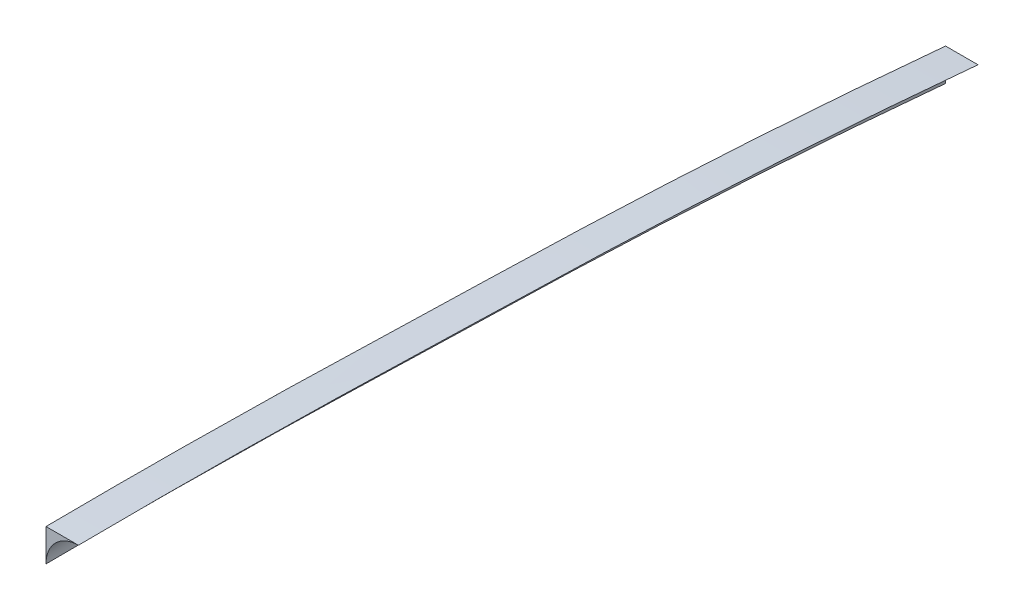
ISO-10303-21;
HEADER;
FILE_DESCRIPTION(('STEP AP214'),'2;1');
FILE_NAME('part.step','',(''),(''),'','','');
FILE_SCHEMA(('AUTOMOTIVE_DESIGN { 1 0 10303 214 1 1 1 1 }'));
ENDSEC;
DATA;
#1=APPLICATION_CONTEXT('core data for automotive mechanical design processes');
#2=APPLICATION_PROTOCOL_DEFINITION('international standard','automotive_design',2000,#1);
#3=PRODUCT_CONTEXT('',#1,'mechanical');
#4=PRODUCT('Part','Part','',(#3));
#5=PRODUCT_RELATED_PRODUCT_CATEGORY('part','',(#4));
#6=PRODUCT_DEFINITION_FORMATION('','',#4);
#7=PRODUCT_DEFINITION_CONTEXT('part definition',#1,'design');
#8=PRODUCT_DEFINITION('design','',#6,#7);
#9=PRODUCT_DEFINITION_SHAPE('','',#8);
#10=(LENGTH_UNIT() NAMED_UNIT(*) SI_UNIT(.MILLI.,.METRE.));
#11=(NAMED_UNIT(*) PLANE_ANGLE_UNIT() SI_UNIT($,.RADIAN.));
#12=(NAMED_UNIT(*) SI_UNIT($,.STERADIAN.) SOLID_ANGLE_UNIT());
#13=UNCERTAINTY_MEASURE_WITH_UNIT(LENGTH_MEASURE(1.E-05),#10,'distance_accuracy_value','');
#14=(GEOMETRIC_REPRESENTATION_CONTEXT(3) GLOBAL_UNCERTAINTY_ASSIGNED_CONTEXT((#13)) GLOBAL_UNIT_ASSIGNED_CONTEXT((#10,
#11,#12)) REPRESENTATION_CONTEXT('',''));
#15=CARTESIAN_POINT('',(0.,0.,0.));
#16=DIRECTION('',(0.,0.,1.));
#17=DIRECTION('',(1.,0.,0.));
#18=AXIS2_PLACEMENT_3D('',#15,#16,#17);
#19=CARTESIAN_POINT('',(545.921789204401,117.985789350312,0.));
#20=DIRECTION('',(0.,0.,-1.));
#21=DIRECTION('',(-1.,0.,0.));
#22=AXIS2_PLACEMENT_3D('',#19,#20,#21);
#23=PLANE('',#22);
#24=DIRECTION('',(0.,-1.,0.));
#25=VECTOR('',#24,1.);
#26=CARTESIAN_POINT('',(469.721789204401,194.185789350312,0.));
#27=LINE('',#26,#25);
#28=CARTESIAN_POINT('',(469.721789204401,194.185789350312,0.));
#29=VERTEX_POINT('',#28);
#30=CARTESIAN_POINT('',(469.721796592813,117.979425274758,-0.00025143511217518));
#31=VERTEX_POINT('',#30);
#32=EDGE_CURVE('E191',#29,#31,#27,.T.);
#33=ORIENTED_EDGE('',*,*,#32,.T.);
#34=CARTESIAN_POINT('',(545.921789204401,117.985789350312,0.));
#35=DIRECTION('',(0.,0.,-1.));
#36=DIRECTION('',(-1.,0.,0.));
#37=AXIS2_PLACEMENT_3D('',#34,#35,#36);
#38=CIRCLE('',#37,76.2);
#39=CARTESIAN_POINT('',(545.921792078561,194.183313666382,-9.78105702587246E-05));
#40=VERTEX_POINT('',#39);
#41=EDGE_CURVE('E78',#31,#40,#38,.T.);
#42=ORIENTED_EDGE('',*,*,#41,.T.);
#43=DIRECTION('',(1.,0.,0.));
#44=VECTOR('',#43,1.);
#45=CARTESIAN_POINT('',(469.721789204401,194.185789350312,0.));
#46=LINE('',#45,#44);
#47=EDGE_CURVE('E13',#29,#40,#46,.T.);
#48=ORIENTED_EDGE('',*,*,#47,.F.);
#49=EDGE_LOOP('',(#33,#42,#48));
#50=FACE_BOUND('',#49,.T.);
#51=ADVANCED_FACE('F68',(#50),#23,.F.);
#52=CARTESIAN_POINT('',(606.246520423227,99.1964787103507,-2052.91158045471));
#53=DIRECTION('',(0.,0.,-1.));
#54=DIRECTION('',(-1.,0.,0.));
#55=AXIS2_PLACEMENT_3D('',#52,#53,#54);
#56=PLANE('',#55);
#57=DIRECTION('',(0.,1.,0.));
#58=VECTOR('',#57,1.);
#59=CARTESIAN_POINT('',(530.046520423227,99.1964787103507,-2052.91158045471));
#60=LINE('',#59,#58);
#61=CARTESIAN_POINT('',(530.046544013096,99.2085460870408,-2052.91238324179));
#62=VERTEX_POINT('',#61);
#63=CARTESIAN_POINT('',(530.046520284828,175.396407935246,-2052.91157574486));
#64=VERTEX_POINT('',#63);
#65=EDGE_CURVE('E110',#62,#64,#60,.T.);
#66=ORIENTED_EDGE('',*,*,#65,.T.);
#67=DIRECTION('',(1.,0.,0.));
#68=VECTOR('',#67,1.);
#69=CARTESIAN_POINT('',(530.046520423227,175.396478710351,-2052.91158045471));
#70=LINE('',#69,#68);
#71=CARTESIAN_POINT('',(606.246529514757,175.401129488513,-2052.91188984868));
#72=VERTEX_POINT('',#71);
#73=EDGE_CURVE('E112',#64,#72,#70,.T.);
#74=ORIENTED_EDGE('',*,*,#73,.T.);
#75=CARTESIAN_POINT('',(606.246520423227,99.1964787103507,-2052.91158045471));
#76=DIRECTION('',(0.,0.,-1.));
#77=DIRECTION('',(-1.,0.,0.));
#78=AXIS2_PLACEMENT_3D('',#75,#76,#77);
#79=CIRCLE('',#78,76.1999999999999);
#80=EDGE_CURVE('E106',#62,#72,#79,.T.);
#81=ORIENTED_EDGE('',*,*,#80,.F.);
#82=EDGE_LOOP('',(#66,#74,#81));
#83=FACE_BOUND('',#82,.T.);
#84=ADVANCED_FACE('F109',(#83),#56,.T.);
#85=CARTESIAN_POINT('',(606.246529514757,175.401129488513,-2052.91188984868));
#86=CARTESIAN_POINT('',(596.872245214797,196.64354472673,-1733.89551946396));
#87=CARTESIAN_POINT('',(587.473353429833,207.338535542105,-1414.04173149098));
#88=CARTESIAN_POINT('',(577.994890395575,207.456825463627,-1091.48005347282));
#89=CARTESIAN_POINT('',(573.92861004286,207.46977992916,-953.100422817129));
#90=CARTESIAN_POINT('',(569.862342610043,207.457360570401,-814.721231838617));
#91=CARTESIAN_POINT('',(565.192095642697,207.457360570505,-655.788006789196));
#92=CARTESIAN_POINT('',(563.826546319493,207.392263536466,-609.316983004313));
#93=CARTESIAN_POINT('',(561.795941851718,206.99889263727,-540.213460402665));
#94=CARTESIAN_POINT('',(559.739448657553,206.30930387688,-470.228918273267));
#95=CARTESIAN_POINT('',(557.682228489811,205.339471183982,-400.219636498245));
#96=CARTESIAN_POINT('',(554.978276083907,203.683375419938,-308.201402932575));
#97=CARTESIAN_POINT('',(552.216748444005,201.41374639747,-214.223825956145));
#98=CARTESIAN_POINT('',(549.008005719743,198.105087894449,-105.027067607676));
#99=CARTESIAN_POINT('',(547.114847768712,195.790455712003,-40.6009889037087));
#100=CARTESIAN_POINT('',(545.921792078561,194.183313666382,-9.78105702587246E-05));
#101=CARTESIAN_POINT('',(599.896528745596,175.40073602574,-2052.91186367336));
#102=CARTESIAN_POINT('',(590.525034891807,196.636980314298,-1733.99045499246));
#103=CARTESIAN_POINT('',(581.128868103074,207.332231678563,-1414.22940139569));
#104=CARTESIAN_POINT('',(571.653061514198,207.456797075328,-1091.75812489902));
#105=CARTESIAN_POINT('',(567.58792177255,207.470438796602,-953.417310390911));
#106=CARTESIAN_POINT('',(563.522795636223,207.457360570401,-815.076958885585));
#107=CARTESIAN_POINT('',(558.853859099506,207.457360570507,-656.188329115092));
#108=CARTESIAN_POINT('',(557.487536770617,207.393504276549,-609.690999165365));
#109=CARTESIAN_POINT('',(555.454292251116,207.000931980056,-540.497632934888));
#110=CARTESIAN_POINT('',(553.397317357057,206.312684302951,-470.49669807118));
#111=CARTESIAN_POINT('',(551.339681419449,205.343406986554,-400.473267227328));
#112=CARTESIAN_POINT('',(548.631936988678,203.686118657451,-308.325987222446));
#113=CARTESIAN_POINT('',(545.871443521592,201.418157999229,-214.383604192278));
#114=CARTESIAN_POINT('',(542.658209961143,198.105411511501,-105.034018148974));
#115=CARTESIAN_POINT('',(540.765487128955,195.791351607397,-40.6227469790423));
#116=CARTESIAN_POINT('',(539.571791839073,194.183519951964,-8.96605351833139E-05));
#117=CARTESIAN_POINT('',(587.196527207275,175.399949100196,-2052.91181132272));
#118=CARTESIAN_POINT('',(577.830614245828,196.623851489432,-1734.18032604947));
#119=CARTESIAN_POINT('',(568.439897449557,207.319623951478,-1414.60474120509));
#120=CARTESIAN_POINT('',(558.969403751443,207.456740298728,-1092.31426775141));
#121=CARTESIAN_POINT('',(554.906545231931,207.471756531486,-954.051085538475));
#122=CARTESIAN_POINT('',(550.843701688584,207.457360570401,-815.788412979518));
#123=CARTESIAN_POINT('',(546.177386013126,207.457360570509,-656.988973766884));
#124=CARTESIAN_POINT('',(544.809517672866,207.395985756716,-610.439031487466));
#125=CARTESIAN_POINT('',(542.770993049913,207.005010665628,-541.065977999333));
#126=CARTESIAN_POINT('',(540.713054756065,206.319445155094,-471.032257667006));
#127=CARTESIAN_POINT('',(538.654587278724,205.351278591697,-400.980528685496));
#128=CARTESIAN_POINT('',(535.939258798222,203.691605132478,-308.575155802187));
#129=CARTESIAN_POINT('',(533.180833676766,201.426981202749,-214.703160664544));
#130=CARTESIAN_POINT('',(529.958618443944,198.106058745606,-105.047919231571));
#131=CARTESIAN_POINT('',(528.066765849441,195.793143398186,-40.6662631297094));
#132=CARTESIAN_POINT('',(526.871791360096,194.183932523129,-7.33604650324926E-05));
#133=CARTESIAN_POINT('',(568.146524899792,175.398768711879,-2052.91173279677));
#134=CARTESIAN_POINT('',(558.788983276858,196.604158252134,-1734.46513263498));
#135=CARTESIAN_POINT('',(549.406441469279,207.300712360851,-1415.1677509192));
#136=CARTESIAN_POINT('',(539.943917107309,207.456655133829,-1093.14848203));
#137=CARTESIAN_POINT('',(535.884480421001,207.473733133812,-955.001748259824));
#138=CARTESIAN_POINT('',(531.825060767123,207.457360570401,-816.855594120421));
#139=CARTESIAN_POINT('',(527.162676383553,207.457360570512,-658.189940744574));
#140=CARTESIAN_POINT('',(525.792489026237,207.399707976966,-611.561079970621));
#141=CARTESIAN_POINT('',(523.746044248107,207.011128693986,-541.918495596003));
#142=CARTESIAN_POINT('',(521.686660854576,206.329586433308,-471.835597060747));
#143=CARTESIAN_POINT('',(519.626946067635,205.363085999411,-401.741420872748));
#144=CARTESIAN_POINT('',(516.900241512535,203.699834845019,-308.948908671801));
#145=CARTESIAN_POINT('',(514.144918909526,201.440216008028,-215.182495372944));
#146=CARTESIAN_POINT('',(510.909231168143,198.107029596764,-105.068770855466));
#147=CARTESIAN_POINT('',(509.018683930168,195.79583108437,-40.7315373557102));
#148=CARTESIAN_POINT('',(507.82179064163,194.184551379877,-4.89103598062606E-05));
#149=CARTESIAN_POINT('',(549.096522592311,175.397588323562,-2052.91165427082));
#150=CARTESIAN_POINT('',(539.74735230789,196.584465014836,-1734.74993922049));
#151=CARTESIAN_POINT('',(530.372985489003,207.281800770224,-1415.73076063331));
#152=CARTESIAN_POINT('',(520.918430463177,207.45656996893,-1093.98269630859));
#153=CARTESIAN_POINT('',(516.862415610073,207.475709736137,-955.952410981169));
#154=CARTESIAN_POINT('',(512.806419845664,207.457360570401,-817.92277526132));
#155=CARTESIAN_POINT('',(508.147966753983,207.457360570516,-659.39090772226));
#156=CARTESIAN_POINT('',(506.77546037961,207.403430197216,-612.683128453773));
#157=CARTESIAN_POINT('',(504.721095446303,207.017246722343,-542.771013192671));
#158=CARTESIAN_POINT('',(502.660266953089,206.339727711521,-472.638936454486));
#159=CARTESIAN_POINT('',(500.599304856548,205.374893407125,-402.502313059999));
#160=CARTESIAN_POINT('',(497.861224226851,203.708064557559,-309.322661541412));
#161=CARTESIAN_POINT('',(495.109004142288,201.453450813307,-215.661830081343));
#162=CARTESIAN_POINT('',(491.859843892345,198.108000447921,-105.08962247936));
#163=CARTESIAN_POINT('',(489.970602010897,195.798518770553,-40.7968115817109));
#164=CARTESIAN_POINT('',(488.771789923165,194.185170236624,-2.44602545800286E-05));
#165=CARTESIAN_POINT('',(536.396521053989,175.396801398018,-2052.91160192018));
#166=CARTESIAN_POINT('',(527.05293166191,196.57133618997,-1734.9398102775));
#167=CARTESIAN_POINT('',(517.684014835485,207.26919304314,-1416.10610044272));
#168=CARTESIAN_POINT('',(508.234772700421,207.456513192331,-1094.53883916099));
#169=CARTESIAN_POINT('',(504.181039069453,207.477027471021,-956.586186128735));
#170=CARTESIAN_POINT('',(500.127325898024,207.457360570401,-818.634229355255));
#171=CARTESIAN_POINT('',(495.471493667602,207.457360570518,-660.191552374053));
#172=CARTESIAN_POINT('',(494.097441281857,207.405911677383,-613.431160775876));
#173=CARTESIAN_POINT('',(492.037796245099,207.021325407916,-543.339358257117));
#174=CARTESIAN_POINT('',(489.976004352097,206.346488563664,-473.174496050312));
#175=CARTESIAN_POINT('',(487.914210715822,205.382765012268,-403.009574518167));
#176=CARTESIAN_POINT('',(485.168546036394,203.713551032586,-309.571830121154));
#177=CARTESIAN_POINT('',(482.418394297461,201.462274016826,-215.98138655361));
#178=CARTESIAN_POINT('',(479.160252375145,198.108647682027,-105.103523561957));
#179=CARTESIAN_POINT('',(477.271880731382,195.800310561342,-40.8403277323781));
#180=CARTESIAN_POINT('',(476.071789444188,194.18558280779,-8.16018442920732E-06));
#181=CARTESIAN_POINT('',(530.046520284828,175.396407935246,-2052.91157574486));
#182=CARTESIAN_POINT('',(520.70572133892,196.564771777538,-1735.034745806));
#183=CARTESIAN_POINT('',(511.339529508726,207.262889179597,-1416.29377034742));
#184=CARTESIAN_POINT('',(501.892943819043,207.456484804031,-1094.81691058718));
#185=CARTESIAN_POINT('',(497.840350799143,207.477686338463,-956.903073702518));
#186=CARTESIAN_POINT('',(493.787778924204,207.457360570401,-818.989956402222));
#187=CARTESIAN_POINT('',(489.133257124411,207.457360570519,-660.591874699949));
#188=CARTESIAN_POINT('',(487.758431732981,207.407152417466,-613.805176936927));
#189=CARTESIAN_POINT('',(485.696146644497,207.023364750701,-543.62353078934));
#190=CARTESIAN_POINT('',(483.633873051601,206.349868989736,-473.442275848226));
#191=CARTESIAN_POINT('',(481.571663645459,205.38670081484,-403.263205247251));
#192=CARTESIAN_POINT('',(478.822206941166,203.7162942701,-309.696414411025));
#193=CARTESIAN_POINT('',(476.073089375048,201.466685618586,-216.141164789743));
#194=CARTESIAN_POINT('',(472.810456616545,198.108971299079,-105.110474103255));
#195=CARTESIAN_POINT('',(470.922520091625,195.801206456736,-40.8620858077116));
#196=CARTESIAN_POINT('',(469.721789204699,194.185789093372,-1.01493537966598E-08));
#197=B_SPLINE_SURFACE_WITH_KNOTS('',3,3,((#85,#86,#87,#88,#89,#90,#91,#92,#93,#94,#95,#96,#97,
#98,#99,#100),(#101,#102,#103,#104,#105,#106,#107,#108,#109,#110,#111,#112,#113,#114,#115,#116),
(#117,#118,#119,#120,#121,#122,#123,#124,#125,#126,#127,#128,#129,#130,#131,#132),(#133,#134,
#135,#136,#137,#138,#139,#140,#141,#142,#143,#144,#145,#146,#147,#148),(#149,#150,#151,#152,
#153,#154,#155,#156,#157,#158,#159,#160,#161,#162,#163,#164),(#165,#166,#167,#168,#169,#170,
#171,#172,#173,#174,#175,#176,#177,#178,#179,#180),(#181,#182,#183,#184,#185,#186,#187,#188,
#189,#190,#191,#192,#193,#194,#195,#196)),.UNSPECIFIED.,.F.,.F.,.F.,(4,1,1,1,4),(4,2,1,2,1,1,1,
1,1,1,1,4),(0.611015470351657,0.708261602763743,0.805507735175829,0.902753867587914,1.),(0.,
0.465386763563958,0.46963566865567,0.666862362246533,0.701036912172466,0.7352114620984,
0.769386012024333,0.803560561950266,0.837735111876199,0.906084211728066,0.940258761653999,1.),.UNSPECIFIED.);
#198=CARTESIAN_POINT('',(530.046520284828,175.396407935246,-2052.91157574486));
#199=CARTESIAN_POINT('',(520.70572133892,196.564771777538,-1735.034745806));
#200=CARTESIAN_POINT('',(511.339529508726,207.262889179597,-1416.29377034742));
#201=CARTESIAN_POINT('',(501.892943819043,207.456484804031,-1094.81691058718));
#202=CARTESIAN_POINT('',(497.840350799143,207.477686338463,-956.903073702518));
#203=CARTESIAN_POINT('',(493.787778924204,207.457360570401,-818.989956402222));
#204=CARTESIAN_POINT('',(489.133257124411,207.457360570519,-660.591874699949));
#205=CARTESIAN_POINT('',(487.758431732981,207.407152417466,-613.805176936927));
#206=CARTESIAN_POINT('',(485.696146644497,207.023364750701,-543.62353078934));
#207=CARTESIAN_POINT('',(483.633873051601,206.349868989736,-473.442275848226));
#208=CARTESIAN_POINT('',(481.571663645459,205.38670081484,-403.263205247251));
#209=CARTESIAN_POINT('',(478.822206941166,203.7162942701,-309.696414411025));
#210=CARTESIAN_POINT('',(476.073089375048,201.466685618586,-216.141164789743));
#211=CARTESIAN_POINT('',(472.810456616545,198.108971299079,-105.110474103255));
#212=CARTESIAN_POINT('',(470.922520091625,195.801206456736,-40.8620858077116));
#213=CARTESIAN_POINT('',(469.721789204699,194.185789093372,-1.01493537966598E-08));
#214=B_SPLINE_CURVE_WITH_KNOTS('',3,(#198,#199,#200,#201,#202,#203,#204,#205,#206,#207,#208,
#209,#210,#211,#212,#213),.UNSPECIFIED.,.F.,.F.,(4,2,1,2,1,1,1,1,1,1,1,4),(0.,0.465386763563958,
0.46963566865567,0.666862362246533,0.701036912172466,0.7352114620984,0.769386012024333,
0.803560561950266,0.837735111876199,0.906084211728066,0.940258761653999,1.),.UNSPECIFIED.);
#215=EDGE_CURVE('E126',#64,#29,#214,.T.);
#216=CARTESIAN_POINT('',(606.246529514757,175.401129488513,-2052.91188984868));
#217=CARTESIAN_POINT('',(596.872245214797,196.64354472673,-1733.89551946396));
#218=CARTESIAN_POINT('',(587.473353429833,207.338535542105,-1414.04173149098));
#219=CARTESIAN_POINT('',(577.994890395575,207.456825463627,-1091.48005347282));
#220=CARTESIAN_POINT('',(573.92861004286,207.46977992916,-953.100422817129));
#221=CARTESIAN_POINT('',(569.862342610043,207.457360570401,-814.721231838617));
#222=CARTESIAN_POINT('',(565.192095642697,207.457360570505,-655.788006789196));
#223=CARTESIAN_POINT('',(563.826546319493,207.392263536466,-609.316983004313));
#224=CARTESIAN_POINT('',(561.795941851718,206.99889263727,-540.213460402665));
#225=CARTESIAN_POINT('',(559.739448657553,206.30930387688,-470.228918273267));
#226=CARTESIAN_POINT('',(557.682228489811,205.339471183982,-400.219636498245));
#227=CARTESIAN_POINT('',(554.978276083907,203.683375419938,-308.201402932575));
#228=CARTESIAN_POINT('',(552.216748444005,201.41374639747,-214.223825956145));
#229=CARTESIAN_POINT('',(549.008005719743,198.105087894449,-105.027067607676));
#230=CARTESIAN_POINT('',(547.114847768712,195.790455712003,-40.6009889037087));
#231=CARTESIAN_POINT('',(545.921792078561,194.183313666382,-9.78105702587246E-05));
#232=B_SPLINE_CURVE_WITH_KNOTS('',3,(#216,#217,#218,#219,#220,#221,#222,#223,#224,#225,#226,
#227,#228,#229,#230,#231),.UNSPECIFIED.,.F.,.F.,(4,2,1,2,1,1,1,1,1,1,1,4),(0.,0.465386763563958,
0.46963566865567,0.666862362246533,0.701036912172466,0.7352114620984,0.769386012024333,
0.803560561950266,0.837735111876199,0.906084211728066,0.940258761653999,1.),.UNSPECIFIED.);
#233=EDGE_CURVE('E93',#72,#40,#232,.T.);
#234=ORIENTED_EDGE('',*,*,#73,.F.);
#235=ORIENTED_EDGE('',*,*,#215,.T.);
#236=ORIENTED_EDGE('',*,*,#47,.T.);
#237=ORIENTED_EDGE('',*,*,#233,.F.);
#238=EDGE_LOOP('',(#234,#235,#236,#237));
#239=FACE_BOUND('',#238,.T.);
#240=ADVANCED_FACE('F159',(#239),#197,.T.);
#241=CARTESIAN_POINT('',(530.046544013096,99.2085460870408,-2052.91238324179));
#242=CARTESIAN_POINT('',(520.619661041988,120.567280985973,-1732.1060269105));
#243=CARTESIAN_POINT('',(511.169404288186,131.257360570468,-1410.50423712749));
#244=CARTESIAN_POINT('',(501.640868438163,131.257360570469,-1086.23853057454));
#245=CARTESIAN_POINT('',(497.553088073338,131.25736057047,-947.127232774277));
#246=CARTESIAN_POINT('',(493.465307708513,131.2573605704,-808.015934974008));
#247=CARTESIAN_POINT('',(488.770359705734,131.257360570484,-648.242108720578));
#248=CARTESIAN_POINT('',(487.419381196428,131.16887613688,-602.26694446102));
#249=CARTESIAN_POINT('',(485.438540531293,130.760451931384,-534.856934365164));
#250=CARTESIAN_POINT('',(483.391127166222,130.04558434661,-465.181387997844));
#251=CARTESIAN_POINT('',(481.341744075833,129.065283053316,-395.438809886958));
#252=CARTESIAN_POINT('',(478.709269654691,127.43166661102,-305.85304439371));
#253=CARTESIAN_POINT('',(475.928248316474,125.130589663397,-211.212077159107));
#254=CARTESIAN_POINT('',(472.804155860048,121.89898785672,-104.896052990789));
#255=CARTESIAN_POINT('',(470.902796112064,119.573568481665,-40.1908588459634));
#256=CARTESIAN_POINT('',(469.721796592813,117.979425274758,-0.00025143511217518));
#257=CARTESIAN_POINT('',(530.046543408998,104.195515367226,-2052.91236268374));
#258=CARTESIAN_POINT('',(520.621852049189,125.549403613628,-1732.18058910022));
#259=CARTESIAN_POINT('',(511.173735502422,136.239687832743,-1410.65163272597));
#260=CARTESIAN_POINT('',(501.647286019722,136.244616579474,-1086.45692736196));
#261=CARTESIAN_POINT('',(497.560401488734,136.245156348872,-947.376115692729));
#262=CARTESIAN_POINT('',(493.473517496077,136.244638875524,-808.295322343367));
#263=CARTESIAN_POINT('',(488.779598703108,136.244638875608,-648.556521140104));
#264=CARTESIAN_POINT('',(487.428013076556,136.157128916986,-602.560696066991));
#265=CARTESIAN_POINT('',(485.445098919645,135.749331932586,-535.08012295006));
#266=CARTESIAN_POINT('',(483.39730722836,135.035517632161,-465.39170175932));
#267=CARTESIAN_POINT('',(481.347597593082,134.055652530551,-395.638010995761));
#268=CARTESIAN_POINT('',(478.712144922575,132.421099449849,-305.950892666162));
#269=CARTESIAN_POINT('',(475.931935821788,130.12133283244,-211.337566692316));
#270=CARTESIAN_POINT('',(472.804316270869,126.886520330082,-104.90151193316));
#271=CARTESIAN_POINT('',(470.903298264424,124.561550421386,-40.2079475983694));
#272=CARTESIAN_POINT('',(469.721796404719,122.966865596199,-0.000245034089595328));
#273=CARTESIAN_POINT('',(531.028656619296,114.169334810069,-2052.91232156765));
#274=CARTESIAN_POINT('',(521.608348482082,135.513529751412,-1732.32971347968));
#275=CARTESIAN_POINT('',(512.164512349384,146.204223239767,-1410.94642392293));
#276=CARTESIAN_POINT('',(502.642235601332,146.219009479958,-1086.89372093682));
#277=CARTESIAN_POINT('',(498.55714273802,146.220628788151,-947.873881529635));
#278=CARTESIAN_POINT('',(494.472051489696,146.219076368245,-808.854097082086));
#279=CARTESIAN_POINT('',(489.780191116346,146.219076368331,-649.185345979156));
#280=CARTESIAN_POINT('',(488.427391255303,146.133515359673,-603.148199278933));
#281=CARTESIAN_POINT('',(486.440330114838,145.726972817464,-535.526500119852));
#282=CARTESIAN_POINT('',(484.39178177113,145.015265085738,-465.812329282273));
#283=CARTESIAN_POINT('',(482.341419046072,144.036272367494,-396.036413213369));
#284=CARTESIAN_POINT('',(479.700009876835,142.399846009979,-306.146589211068));
#285=CARTESIAN_POINT('',(476.921425250907,140.102700053,-211.588545758737));
#286=CARTESIAN_POINT('',(473.786751511002,136.861466159281,-104.9124298179));
#287=CARTESIAN_POINT('',(471.886416987636,134.537395183301,-40.2421251031816));
#288=CARTESIAN_POINT('',(470.703910447023,132.941627121555,-0.000232232044435623));
#289=CARTESIAN_POINT('',(535.393025205233,128.55520871486,-2052.91225989351));
#290=CARTESIAN_POINT('',(525.979291901913,149.884863698614,-1732.55340004886));
#291=CARTESIAN_POINT('',(516.541876390321,160.576171090828,-1411.38861071836));
#292=CARTESIAN_POINT('',(507.025858744239,160.60574357121,-1087.54891129911));
#293=CARTESIAN_POINT('',(502.943453382441,160.608982187594,-948.620530284988));
#294=CARTESIAN_POINT('',(498.861051250619,160.605877347851,-809.692259190159));
#295=CARTESIAN_POINT('',(494.172278506698,160.605877347941,-650.128583237732));
#296=CARTESIAN_POINT('',(492.817657293918,160.523239764228,-604.029454096843));
#297=CARTESIAN_POINT('',(490.824375678123,160.118578885306,-536.196065874538));
#298=CARTESIAN_POINT('',(488.774692355778,159.410031006628,-466.443270566699));
#299=CARTESIAN_POINT('',(486.723349996051,158.432346863434,-396.634016539779));
#300=CARTESIAN_POINT('',(484.073006078718,156.793110590701,-306.440134028426));
#301=CARTESIAN_POINT('',(481.296858165081,154.499895624366,-211.965014358366));
#302=CARTESIAN_POINT('',(478.151603141696,151.249029643604,-104.928806645011));
#303=CARTESIAN_POINT('',(476.25229384295,148.926307066701,-40.2933913603997));
#304=CARTESIAN_POINT('',(475.068280280974,147.328914150115,-0.000213028976696066));
#305=CARTESIAN_POINT('',(542.479969326576,141.813202424695,-2052.91219821938));
#306=CARTESIAN_POINT('',(533.072810857148,163.12831745086,-1732.77708661805));
#307=CARTESIAN_POINT('',(523.64181596666,173.820238746935,-1411.8307975138));
#308=CARTESIAN_POINT('',(514.132057422549,173.864597467506,-1088.20410166139));
#309=CARTESIAN_POINT('',(510.052339562265,173.869455392081,-949.367179040348));
#310=CARTESIAN_POINT('',(505.972626546943,173.864798132503,-810.530421298238));
#311=CARTESIAN_POINT('',(501.286941432451,173.864798132594,-651.071820496311));
#312=CARTESIAN_POINT('',(499.930498867933,173.785083973827,-604.910708914757));
#313=CARTESIAN_POINT('',(497.930996776808,173.382304758194,-536.865631629228));
#314=CARTESIAN_POINT('',(495.880178475826,172.676916732563,-467.074211851129));
#315=CARTESIAN_POINT('',(493.82785648143,171.700541164418,-397.231619866191));
#316=CARTESIAN_POINT('',(491.168577816002,170.058494976467,-306.733678845785));
#317=CARTESIAN_POINT('',(488.394866614654,167.769211000776,-212.341482957996));
#318=CARTESIAN_POINT('',(485.239030307789,164.508712932971,-104.945183472122));
#319=CARTESIAN_POINT('',(483.340746233662,162.187338755144,-40.344657617618));
#320=CARTESIAN_POINT('',(482.155225650324,160.588320983719,-0.000193825908956509));
#321=CARTESIAN_POINT('',(552.017570890895,153.433803660806,-2052.91213654523));
#322=CARTESIAN_POINT('',(542.616987255361,174.734378729381,-1733.00077318723));
#323=CARTESIAN_POINT('',(533.192412985979,185.426913929316,-1412.27298430924));
#324=CARTESIAN_POINT('',(523.688913543838,185.486058890078,-1088.85929202368));
#325=CARTESIAN_POINT('',(519.611883185068,185.492536122845,-950.113827795702));
#326=CARTESIAN_POINT('',(515.534859286247,185.48632644343,-811.368583406312));
#327=CARTESIAN_POINT('',(510.852261801185,185.486326443524,-652.015057754887));
#328=CARTESIAN_POINT('',(509.49399788493,185.409535709703,-605.791963732667));
#329=CARTESIAN_POINT('',(507.488275318475,185.008638157357,-537.535197383914));
#330=CARTESIAN_POINT('',(505.436322038856,184.306409984775,-467.705153135555));
#331=CARTESIAN_POINT('',(503.383020409792,183.331342991679,-397.829223192601));
#332=CARTESIAN_POINT('',(500.714806996268,181.686486888509,-307.027223663142));
#333=CARTESIAN_POINT('',(497.943532507209,179.401133903463,-212.717951557625));
#334=CARTESIAN_POINT('',(494.777114916865,176.131003748614,-104.961560299233));
#335=CARTESIAN_POINT('',(492.879856067358,173.810977969864,-40.395923874836));
#336=CARTESIAN_POINT('',(491.692828462657,172.210335343599,-0.000174622841216952));
#337=CARTESIAN_POINT('',(563.639097389533,162.970479962606,-2052.9120748711));
#338=CARTESIAN_POINT('',(554.245088587892,184.256515073592,-1733.22445975641));
#339=CARTESIAN_POINT('',(544.826934939614,194.949664177387,-1412.71517110467));
#340=CARTESIAN_POINT('',(535.329694599444,195.023595378338,-1089.51448238596));
#341=CARTESIAN_POINT('',(531.255351742187,195.031691919297,-950.86047655106));
#342=CARTESIAN_POINT('',(527.181016959868,195.023929820046,-812.206745514389));
#343=CARTESIAN_POINT('',(522.501507104234,195.023929820143,-652.958295013465));
#344=CARTESIAN_POINT('',(521.141421836242,194.950062511266,-606.673218550579));
#345=CARTESIAN_POINT('',(519.129478794457,194.551046622208,-538.204763138602));
#346=CARTESIAN_POINT('',(517.076390536202,193.851978302674,-468.336094419984));
#347=CARTESIAN_POINT('',(515.022109272468,192.878219884628,-398.426826519012));
#348=CARTESIAN_POINT('',(512.344961110849,191.230553866239,-307.320768480501));
#349=CARTESIAN_POINT('',(509.576123334079,188.949131871837,-213.094420157255));
#350=CARTESIAN_POINT('',(506.399124460255,185.669369629946,-104.977937126344));
#351=CARTESIAN_POINT('',(504.502890835367,183.350692250271,-40.4471901320542));
#352=CARTESIAN_POINT('',(503.314356209304,181.748424769168,-0.000155419773477395));
#353=CARTESIAN_POINT('',(576.898016361889,170.05649882142,-2052.91201319695));
#354=CARTESIAN_POINT('',(567.510582394142,191.327993974817,-1733.44814632559));
#355=CARTESIAN_POINT('',(558.098849366969,202.021756982472,-1413.15735790011));
#356=CARTESIAN_POINT('',(548.60786812877,202.110474423613,-1090.16967274825));
#357=CARTESIAN_POINT('',(544.536212773027,202.120190272764,-951.607125306416));
#358=CARTESIAN_POINT('',(540.464567107208,202.110875753676,-813.044907622465));
#359=CARTESIAN_POINT('',(535.788144881004,202.110875753776,-653.901532272042));
#360=CARTESIAN_POINT('',(534.426238261275,202.039931869845,-607.55447336849));
#361=CARTESIAN_POINT('',(532.40807474416,201.642797644075,-538.874328893289));
#362=CARTESIAN_POINT('',(530.353851507268,200.946889177588,-468.967035704411));
#363=CARTESIAN_POINT('',(528.298590608865,199.974439334592,-399.024429845423));
#364=CARTESIAN_POINT('',(525.61250769915,198.323963400984,-307.614313297859));
#365=CARTESIAN_POINT('',(522.84610663467,196.046472397227,-213.470888756885));
#366=CARTESIAN_POINT('',(519.658526477367,192.757078068293,-104.994313953454));
#367=CARTESIAN_POINT('',(517.763318077098,190.439749087695,-40.4984563892724));
#368=CARTESIAN_POINT('',(516.573276429672,188.835856751752,-0.000136216705737838));
#369=CARTESIAN_POINT('',(591.284815529206,174.419942144838,-2052.91195152282));
#370=CARTESIAN_POINT('',(581.903956395352,195.676897340645,-1733.67183289478));
#371=CARTESIAN_POINT('',(572.498643989284,206.371274252159,-1413.59954469555));
#372=CARTESIAN_POINT('',(563.013921853055,206.474777933491,-1090.82486311053));
#373=CARTESIAN_POINT('',(558.944953998826,206.486113090833,-952.353774061773));
#374=CARTESIAN_POINT('',(554.875997449508,206.475246151909,-813.883069730542));
#375=CARTESIAN_POINT('',(550.202662852732,206.475246152011,-654.844769530619));
#376=CARTESIAN_POINT('',(548.838934881266,206.407225693026,-608.435728186402));
#377=CARTESIAN_POINT('',(546.814550888821,206.011973130543,-539.543894647977));
#378=CARTESIAN_POINT('',(544.759192673292,205.319224517104,-469.59797698884));
#379=CARTESIAN_POINT('',(542.70295214022,204.348083249158,-399.622033171834));
#380=CARTESIAN_POINT('',(540.007934482411,202.694797400331,-307.907858115217));
#381=CARTESIAN_POINT('',(537.24397013022,200.421237387219,-213.847357356515));
#382=CARTESIAN_POINT('',(534.045808689437,197.122210971241,-105.010690780565));
#383=CARTESIAN_POINT('',(532.151625513787,194.806230389719,-40.5497226464906));
#384=CARTESIAN_POINT('',(530.960076844998,193.200713198937,-0.000117013637998282));
#385=CARTESIAN_POINT('',(601.259251813731,175.401438513451,-2052.91191040672));
#386=CARTESIAN_POINT('',(591.882775902473,196.648700404199,-1733.82095727423));
#387=CARTESIAN_POINT('',(582.481743910474,207.343486584954,-1413.8943358925));
#388=CARTESIAN_POINT('',(573.001194508893,207.456847759746,-1091.26165668539));
#389=CARTESIAN_POINT('',(568.93401832234,207.469262455881,-952.851539898676));
#390=CARTESIAN_POINT('',(564.866854517356,207.457360570401,-814.441844469259));
#391=CARTESIAN_POINT('',(560.1955783402,207.457360570505,-655.47359436967));
#392=CARTESIAN_POINT('',(558.830636134242,207.391289061483,-609.023231398343));
#393=CARTESIAN_POINT('',(556.802105158244,206.997290941192,-539.990271817769));
#394=CARTESIAN_POINT('',(554.74599029029,206.306648896452,-470.018604511791));
#395=CARTESIAN_POINT('',(552.689096667439,205.336380011871,-400.020435389441));
#396=CARTESIAN_POINT('',(549.988122510899,203.681220886233,-308.103554660122));
#397=CARTESIAN_POINT('',(547.225782633568,201.41028153355,-214.098336422935));
#398=CARTESIAN_POINT('',(544.020567003799,198.10483372621,-105.021608665306));
#399=CARTESIAN_POINT('',(542.127067311229,195.789752077405,-40.5839001513027));
#400=CARTESIAN_POINT('',(540.934513961532,194.183151650064,-0.000104211592838577));
#401=CARTESIAN_POINT('',(606.246529514757,175.401129488513,-2052.91188984868));
#402=CARTESIAN_POINT('',(596.872245214797,196.64354472673,-1733.89551946396));
#403=CARTESIAN_POINT('',(587.473353429833,207.338535542105,-1414.04173149098));
#404=CARTESIAN_POINT('',(577.994890395575,207.456825463627,-1091.48005347282));
#405=CARTESIAN_POINT('',(573.92861004286,207.46977992916,-953.100422817129));
#406=CARTESIAN_POINT('',(569.862342610043,207.457360570401,-814.721231838617));
#407=CARTESIAN_POINT('',(565.192095642697,207.457360570505,-655.788006789196));
#408=CARTESIAN_POINT('',(563.826546319493,207.392263536466,-609.316983004313));
#409=CARTESIAN_POINT('',(561.795941851718,206.99889263727,-540.213460402665));
#410=CARTESIAN_POINT('',(559.739448657553,206.30930387688,-470.228918273267));
#411=CARTESIAN_POINT('',(557.682228489811,205.339471183982,-400.219636498245));
#412=CARTESIAN_POINT('',(554.978276083907,203.683375419938,-308.201402932575));
#413=CARTESIAN_POINT('',(552.216748444005,201.41374639747,-214.223825956145));
#414=CARTESIAN_POINT('',(549.008005719743,198.105087894449,-105.027067607676));
#415=CARTESIAN_POINT('',(547.114847768712,195.790455712003,-40.6009889037087));
#416=CARTESIAN_POINT('',(545.921792078561,194.183313666382,-9.78105702587246E-05));
#417=B_SPLINE_SURFACE_WITH_KNOTS('',3,3,((#241,#242,#243,#244,#245,#246,#247,#248,#249,#250,
#251,#252,#253,#254,#255,#256),(#257,#258,#259,#260,#261,#262,#263,#264,#265,#266,#267,#268,
#269,#270,#271,#272),(#273,#274,#275,#276,#277,#278,#279,#280,#281,#282,#283,#284,#285,#286,
#287,#288),(#289,#290,#291,#292,#293,#294,#295,#296,#297,#298,#299,#300,#301,#302,#303,#304),
(#305,#306,#307,#308,#309,#310,#311,#312,#313,#314,#315,#316,#317,#318,#319,#320),(#321,#322,
#323,#324,#325,#326,#327,#328,#329,#330,#331,#332,#333,#334,#335,#336),(#337,#338,#339,#340,
#341,#342,#343,#344,#345,#346,#347,#348,#349,#350,#351,#352),(#353,#354,#355,#356,#357,#358,
#359,#360,#361,#362,#363,#364,#365,#366,#367,#368),(#369,#370,#371,#372,#373,#374,#375,#376,
#377,#378,#379,#380,#381,#382,#383,#384),(#385,#386,#387,#388,#389,#390,#391,#392,#393,#394,
#395,#396,#397,#398,#399,#400),(#401,#402,#403,#404,#405,#406,#407,#408,#409,#410,#411,#412,
#413,#414,#415,#416)),.UNSPECIFIED.,.F.,.F.,.F.,(4,1,1,1,1,1,1,1,4),(4,2,1,2,1,1,1,1,1,1,1,4),
(0.,0.0763769337939571,0.152753867587914,0.229130801381871,0.305507735175829,0.381884668969786,
0.458261602763743,0.5346385365577,0.611015470351657),(0.,0.465386763563958,0.46963566865567,
0.666862362246533,0.701036912172466,0.7352114620984,0.769386012024333,0.803560561950266,
0.837735111876199,0.906084211728066,0.940258761653999,1.),.UNSPECIFIED.);
#418=CARTESIAN_POINT('',(530.046544013096,99.2085460870408,-2052.91238324179));
#419=CARTESIAN_POINT('',(520.619661041988,120.567280985973,-1732.1060269105));
#420=CARTESIAN_POINT('',(511.169404288186,131.257360570468,-1410.50423712749));
#421=CARTESIAN_POINT('',(501.640868438163,131.257360570469,-1086.23853057454));
#422=CARTESIAN_POINT('',(497.553088073338,131.25736057047,-947.127232774277));
#423=CARTESIAN_POINT('',(493.465307708513,131.2573605704,-808.015934974008));
#424=CARTESIAN_POINT('',(488.770359705734,131.257360570484,-648.242108720578));
#425=CARTESIAN_POINT('',(487.419381196428,131.16887613688,-602.26694446102));
#426=CARTESIAN_POINT('',(485.438540531293,130.760451931384,-534.856934365164));
#427=CARTESIAN_POINT('',(483.391127166222,130.04558434661,-465.181387997844));
#428=CARTESIAN_POINT('',(481.341744075833,129.065283053316,-395.438809886958));
#429=CARTESIAN_POINT('',(478.709269654691,127.43166661102,-305.85304439371));
#430=CARTESIAN_POINT('',(475.928248316474,125.130589663397,-211.212077159107));
#431=CARTESIAN_POINT('',(472.804155860048,121.89898785672,-104.896052990789));
#432=CARTESIAN_POINT('',(470.902796112064,119.573568481665,-40.1908588459634));
#433=CARTESIAN_POINT('',(469.721796592813,117.979425274758,-0.00025143511217518));
#434=B_SPLINE_CURVE_WITH_KNOTS('',3,(#418,#419,#420,#421,#422,#423,#424,#425,#426,#427,#428,
#429,#430,#431,#432,#433),.UNSPECIFIED.,.F.,.F.,(4,2,1,2,1,1,1,1,1,1,1,4),(0.,0.465386763563958,
0.46963566865567,0.666862362246533,0.701036912172466,0.7352114620984,0.769386012024333,
0.803560561950266,0.837735111876199,0.906084211728066,0.940258761653999,1.),.UNSPECIFIED.);
#435=EDGE_CURVE('E116',#62,#31,#434,.T.);
#436=CARTESIAN_POINT('',(530.046544013096,99.2085460870408,-2052.91238324179));
#437=CARTESIAN_POINT('',(520.619661041988,120.567280985973,-1732.1060269105));
#438=CARTESIAN_POINT('',(511.169404288186,131.257360570468,-1410.50423712749));
#439=CARTESIAN_POINT('',(501.640868438163,131.257360570469,-1086.23853057454));
#440=CARTESIAN_POINT('',(497.553088073338,131.25736057047,-947.127232774277));
#441=CARTESIAN_POINT('',(493.465307708513,131.2573605704,-808.015934974008));
#442=CARTESIAN_POINT('',(488.770359705734,131.257360570484,-648.242108720578));
#443=CARTESIAN_POINT('',(487.419381196428,131.16887613688,-602.26694446102));
#444=CARTESIAN_POINT('',(485.438540531293,130.760451931384,-534.856934365164));
#445=CARTESIAN_POINT('',(483.391127166222,130.04558434661,-465.181387997844));
#446=CARTESIAN_POINT('',(481.341744075833,129.065283053316,-395.438809886958));
#447=CARTESIAN_POINT('',(478.709269654691,127.43166661102,-305.85304439371));
#448=CARTESIAN_POINT('',(475.928248316474,125.130589663397,-211.212077159107));
#449=CARTESIAN_POINT('',(472.804155860048,121.89898785672,-104.896052990789));
#450=CARTESIAN_POINT('',(470.902796112064,119.573568481665,-40.1908588459634));
#451=CARTESIAN_POINT('',(469.721796592813,117.979425274758,-0.00025143511217518));
#452=CARTESIAN_POINT('',(469.72179342984,117.979421005296,-0.000143795944260833));
#453=CARTESIAN_POINT('',(469.721790266867,117.979416735835,-3.61567763464868E-05));
#454=CARTESIAN_POINT('',(469.721787103894,117.979412466373,7.14823915678599E-05));
#455=CARTESIAN_POINT('',(530.046543408998,104.195515367226,-2052.91236268374));
#456=CARTESIAN_POINT('',(520.621852049189,125.549403613628,-1732.18058910022));
#457=CARTESIAN_POINT('',(511.173735502422,136.239687832743,-1410.65163272597));
#458=CARTESIAN_POINT('',(501.647286019722,136.244616579474,-1086.45692736196));
#459=CARTESIAN_POINT('',(497.560401488734,136.245156348872,-947.376115692729));
#460=CARTESIAN_POINT('',(493.473517496077,136.244638875524,-808.295322343367));
#461=CARTESIAN_POINT('',(488.779598703108,136.244638875608,-648.556521140104));
#462=CARTESIAN_POINT('',(487.428013076556,136.157128916986,-602.560696066991));
#463=CARTESIAN_POINT('',(485.445098919645,135.749331932586,-535.08012295006));
#464=CARTESIAN_POINT('',(483.39730722836,135.035517632161,-465.39170175932));
#465=CARTESIAN_POINT('',(481.347597593082,134.055652530551,-395.638010995761));
#466=CARTESIAN_POINT('',(478.712144922575,132.421099449849,-305.950892666162));
#467=CARTESIAN_POINT('',(475.931935821788,130.12133283244,-211.337566692316));
#468=CARTESIAN_POINT('',(472.804316270869,126.886520330082,-104.90151193316));
#469=CARTESIAN_POINT('',(470.903298264424,124.561550421386,-40.2079475983694));
#470=CARTESIAN_POINT('',(469.721796404719,122.966865596199,-0.000245034089595328));
#471=CARTESIAN_POINT('',(469.721793240401,122.966861325287,-0.000137349137150491));
#472=CARTESIAN_POINT('',(469.721790076082,122.966857054375,-2.96641847056539E-05));
#473=CARTESIAN_POINT('',(469.721786911764,122.966852783463,7.80207677391831E-05));
#474=CARTESIAN_POINT('',(531.028656619296,114.169334810069,-2052.91232156765));
#475=CARTESIAN_POINT('',(521.608348482082,135.513529751412,-1732.32971347968));
#476=CARTESIAN_POINT('',(512.164512349384,146.204223239767,-1410.94642392293));
#477=CARTESIAN_POINT('',(502.642235601332,146.219009479958,-1086.89372093682));
#478=CARTESIAN_POINT('',(498.55714273802,146.220628788151,-947.873881529635));
#479=CARTESIAN_POINT('',(494.472051489696,146.219076368245,-808.854097082086));
#480=CARTESIAN_POINT('',(489.780191116346,146.219076368331,-649.185345979156));
#481=CARTESIAN_POINT('',(488.427391255303,146.133515359673,-603.148199278933));
#482=CARTESIAN_POINT('',(486.440330114838,145.726972817464,-535.526500119852));
#483=CARTESIAN_POINT('',(484.39178177113,145.015265085738,-465.812329282273));
#484=CARTESIAN_POINT('',(482.341419046072,144.036272367494,-396.036413213369));
#485=CARTESIAN_POINT('',(479.700009876835,142.399846009979,-306.146589211068));
#486=CARTESIAN_POINT('',(476.921425250907,140.102700053,-211.588545758737));
#487=CARTESIAN_POINT('',(473.786751511002,136.861466159281,-104.9124298179));
#488=CARTESIAN_POINT('',(471.886416987636,134.537395183301,-40.2421251031816));
#489=CARTESIAN_POINT('',(470.703910447023,132.941627121555,-0.000232232044435623));
#490=CARTESIAN_POINT('',(470.703907280014,132.941622847742,-0.000124455522929805));
#491=CARTESIAN_POINT('',(470.703904113005,132.941618573929,-1.66790014239877E-05));
#492=CARTESIAN_POINT('',(470.703900945996,132.941614300116,9.109752008183E-05));
#493=CARTESIAN_POINT('',(535.393025205233,128.55520871486,-2052.91225989351));
#494=CARTESIAN_POINT('',(525.979291901913,149.884863698614,-1732.55340004886));
#495=CARTESIAN_POINT('',(516.541876390321,160.576171090828,-1411.38861071836));
#496=CARTESIAN_POINT('',(507.025858744239,160.60574357121,-1087.54891129911));
#497=CARTESIAN_POINT('',(502.943453382441,160.608982187594,-948.620530284988));
#498=CARTESIAN_POINT('',(498.861051250619,160.605877347851,-809.692259190159));
#499=CARTESIAN_POINT('',(494.172278506698,160.605877347941,-650.128583237732));
#500=CARTESIAN_POINT('',(492.817657293918,160.523239764228,-604.029454096843));
#501=CARTESIAN_POINT('',(490.824375678123,160.118578885306,-536.196065874538));
#502=CARTESIAN_POINT('',(488.774692355778,159.410031006628,-466.443270566699));
#503=CARTESIAN_POINT('',(486.723349996051,158.432346863434,-396.634016539779));
#504=CARTESIAN_POINT('',(484.073006078718,156.793110590701,-306.440134028426));
#505=CARTESIAN_POINT('',(481.296858165081,154.499895624366,-211.965014358366));
#506=CARTESIAN_POINT('',(478.151603141696,151.249029643604,-104.928806645011));
#507=CARTESIAN_POINT('',(476.25229384295,148.926307066701,-40.2933913603997));
#508=CARTESIAN_POINT('',(475.068280280974,147.328914150115,-0.000213028976696066));
#509=CARTESIAN_POINT('',(475.068277109929,147.32890987195,-0.000105115101598778));
#510=CARTESIAN_POINT('',(475.068273938883,147.328905593785,2.79877349851059E-06));
#511=CARTESIAN_POINT('',(475.068270767838,147.32890131562,0.000110712648595799));
#512=CARTESIAN_POINT('',(542.479969326576,141.813202424695,-2052.91219821938));
#513=CARTESIAN_POINT('',(533.072810857148,163.12831745086,-1732.77708661805));
#514=CARTESIAN_POINT('',(523.64181596666,173.820238746935,-1411.8307975138));
#515=CARTESIAN_POINT('',(514.132057422549,173.864597467506,-1088.20410166139));
#516=CARTESIAN_POINT('',(510.052339562265,173.869455392081,-949.367179040348));
#517=CARTESIAN_POINT('',(505.972626546943,173.864798132503,-810.530421298238));
#518=CARTESIAN_POINT('',(501.286941432451,173.864798132594,-651.071820496311));
#519=CARTESIAN_POINT('',(499.930498867933,173.785083973827,-604.910708914757));
#520=CARTESIAN_POINT('',(497.930996776808,173.382304758194,-536.865631629228));
#521=CARTESIAN_POINT('',(495.880178475826,172.676916732563,-467.074211851129));
#522=CARTESIAN_POINT('',(493.82785648143,171.700541164418,-397.231619866191));
#523=CARTESIAN_POINT('',(491.168577816002,170.058494976467,-306.733678845785));
#524=CARTESIAN_POINT('',(488.394866614654,167.769211000776,-212.341482957996));
#525=CARTESIAN_POINT('',(485.239030307789,164.508712932971,-104.945183472122));
#526=CARTESIAN_POINT('',(483.340746233662,162.187338755144,-40.344657617618));
#527=CARTESIAN_POINT('',(482.155225650324,160.588320983719,-0.000193825908956509));
#528=CARTESIAN_POINT('',(482.155222475242,160.588316701203,-8.57746802677496E-05));
#529=CARTESIAN_POINT('',(482.155219300161,160.588312418686,2.22765484210102E-05));
#530=CARTESIAN_POINT('',(482.15521612508,160.588308136169,0.00013032777710977));
#531=CARTESIAN_POINT('',(552.017570890895,153.433803660806,-2052.91213654523));
#532=CARTESIAN_POINT('',(542.616987255361,174.734378729381,-1733.00077318723));
#533=CARTESIAN_POINT('',(533.192412985979,185.426913929316,-1412.27298430924));
#534=CARTESIAN_POINT('',(523.688913543838,185.486058890078,-1088.85929202368));
#535=CARTESIAN_POINT('',(519.611883185068,185.492536122845,-950.113827795702));
#536=CARTESIAN_POINT('',(515.534859286247,185.48632644343,-811.368583406312));
#537=CARTESIAN_POINT('',(510.852261801185,185.486326443524,-652.015057754887));
#538=CARTESIAN_POINT('',(509.49399788493,185.409535709703,-605.791963732667));
#539=CARTESIAN_POINT('',(507.488275318475,185.008638157357,-537.535197383914));
#540=CARTESIAN_POINT('',(505.436322038856,184.306409984775,-467.705153135555));
#541=CARTESIAN_POINT('',(503.383020409792,183.331342991679,-397.829223192601));
#542=CARTESIAN_POINT('',(500.714806996268,181.686486888509,-307.027223663142));
#543=CARTESIAN_POINT('',(497.943532507209,179.401133903463,-212.717951557625));
#544=CARTESIAN_POINT('',(494.777114916865,176.131003748614,-104.961560299233));
#545=CARTESIAN_POINT('',(492.879856067358,173.810977969864,-40.395923874836));
#546=CARTESIAN_POINT('',(491.692828462657,172.210335343599,-0.000174622841216952));
#547=CARTESIAN_POINT('',(491.692825283539,172.210331056731,-6.6434258936722E-05));
#548=CARTESIAN_POINT('',(491.692822104422,172.210326769863,4.17543233435084E-05));
#549=CARTESIAN_POINT('',(491.692818925304,172.210322482995,0.000149942905623739));
#550=CARTESIAN_POINT('',(563.639097389533,162.970479962606,-2052.9120748711));
#551=CARTESIAN_POINT('',(554.245088587892,184.256515073592,-1733.22445975641));
#552=CARTESIAN_POINT('',(544.826934939614,194.949664177387,-1412.71517110467));
#553=CARTESIAN_POINT('',(535.329694599444,195.023595378338,-1089.51448238596));
#554=CARTESIAN_POINT('',(531.255351742187,195.031691919297,-950.86047655106));
#555=CARTESIAN_POINT('',(527.181016959868,195.023929820046,-812.206745514389));
#556=CARTESIAN_POINT('',(522.501507104234,195.023929820143,-652.958295013465));
#557=CARTESIAN_POINT('',(521.141421836242,194.950062511266,-606.673218550579));
#558=CARTESIAN_POINT('',(519.129478794457,194.551046622208,-538.204763138602));
#559=CARTESIAN_POINT('',(517.076390536202,193.851978302674,-468.336094419984));
#560=CARTESIAN_POINT('',(515.022109272468,192.878219884628,-398.426826519012));
#561=CARTESIAN_POINT('',(512.344961110849,191.230553866239,-307.320768480501));
#562=CARTESIAN_POINT('',(509.576123334079,188.949131871837,-213.094420157255));
#563=CARTESIAN_POINT('',(506.399124460255,185.669369629946,-104.977937126344));
#564=CARTESIAN_POINT('',(504.502890835367,183.350692250271,-40.4471901320542));
#565=CARTESIAN_POINT('',(503.314356209304,181.748424769168,-0.000155419773477395));
#566=CARTESIAN_POINT('',(503.31435302615,181.748420477948,-4.7093837605694E-05));
#567=CARTESIAN_POINT('',(503.314349842996,181.748416186728,6.12320982660074E-05));
#568=CARTESIAN_POINT('',(503.314346659843,181.748411895508,0.000169558034137709));
#569=CARTESIAN_POINT('',(576.898016361889,170.05649882142,-2052.91201319695));
#570=CARTESIAN_POINT('',(567.510582394142,191.327993974817,-1733.44814632559));
#571=CARTESIAN_POINT('',(558.098849366969,202.021756982472,-1413.15735790011));
#572=CARTESIAN_POINT('',(548.60786812877,202.110474423613,-1090.16967274825));
#573=CARTESIAN_POINT('',(544.536212773027,202.120190272764,-951.607125306416));
#574=CARTESIAN_POINT('',(540.464567107208,202.110875753676,-813.044907622465));
#575=CARTESIAN_POINT('',(535.788144881004,202.110875753776,-653.901532272042));
#576=CARTESIAN_POINT('',(534.426238261275,202.039931869845,-607.55447336849));
#577=CARTESIAN_POINT('',(532.40807474416,201.642797644075,-538.874328893289));
#578=CARTESIAN_POINT('',(530.353851507268,200.946889177588,-468.967035704411));
#579=CARTESIAN_POINT('',(528.298590608865,199.974439334592,-399.024429845423));
#580=CARTESIAN_POINT('',(525.61250769915,198.323963400984,-307.614313297859));
#581=CARTESIAN_POINT('',(522.84610663467,196.046472397227,-213.470888756885));
#582=CARTESIAN_POINT('',(519.658526477367,192.757078068293,-104.994313953454));
#583=CARTESIAN_POINT('',(517.763318077098,190.439749087695,-40.4984563892724));
#584=CARTESIAN_POINT('',(516.573276429672,188.835856751752,-0.000136216705737838));
#585=CARTESIAN_POINT('',(516.573273242483,188.83585245618,-2.77534162746661E-05));
#586=CARTESIAN_POINT('',(516.573270055293,188.835848160608,8.07098731885062E-05));
#587=CARTESIAN_POINT('',(516.573266868103,188.835843865037,0.000189173162651678));
#588=CARTESIAN_POINT('',(591.284815529206,174.419942144838,-2052.91195152282));
#589=CARTESIAN_POINT('',(581.903956395352,195.676897340645,-1733.67183289478));
#590=CARTESIAN_POINT('',(572.498643989284,206.371274252159,-1413.59954469555));
#591=CARTESIAN_POINT('',(563.013921853055,206.474777933491,-1090.82486311053));
#592=CARTESIAN_POINT('',(558.944953998826,206.486113090833,-952.353774061773));
#593=CARTESIAN_POINT('',(554.875997449508,206.475246151909,-813.883069730542));
#594=CARTESIAN_POINT('',(550.202662852732,206.475246152011,-654.844769530619));
#595=CARTESIAN_POINT('',(548.838934881266,206.407225693026,-608.435728186402));
#596=CARTESIAN_POINT('',(546.814550888821,206.011973130543,-539.543894647977));
#597=CARTESIAN_POINT('',(544.759192673292,205.319224517104,-469.59797698884));
#598=CARTESIAN_POINT('',(542.70295214022,204.348083249158,-399.622033171834));
#599=CARTESIAN_POINT('',(540.007934482411,202.694797400331,-307.907858115217));
#600=CARTESIAN_POINT('',(537.24397013022,200.421237387219,-213.847357356515));
#601=CARTESIAN_POINT('',(534.045808689437,197.122210971241,-105.010690780565));
#602=CARTESIAN_POINT('',(532.151625513787,194.806230389719,-40.5497226464906));
#603=CARTESIAN_POINT('',(530.960076844998,193.200713198937,-0.000117013637998282));
#604=CARTESIAN_POINT('',(530.960073653772,193.200708899014,-8.41299494363825E-06));
#605=CARTESIAN_POINT('',(530.960070462547,193.20070459909,0.000100187648111005));
#606=CARTESIAN_POINT('',(530.960067271321,193.200700299167,0.000208788291165648));
#607=CARTESIAN_POINT('',(601.259251813731,175.401438513451,-2052.91191040672));
#608=CARTESIAN_POINT('',(591.882775902473,196.648700404199,-1733.82095727423));
#609=CARTESIAN_POINT('',(582.481743910474,207.343486584954,-1413.8943358925));
#610=CARTESIAN_POINT('',(573.001194508893,207.456847759746,-1091.26165668539));
#611=CARTESIAN_POINT('',(568.93401832234,207.469262455881,-952.851539898676));
#612=CARTESIAN_POINT('',(564.866854517356,207.457360570401,-814.441844469259));
#613=CARTESIAN_POINT('',(560.1955783402,207.457360570505,-655.47359436967));
#614=CARTESIAN_POINT('',(558.830636134242,207.391289061483,-609.023231398343));
#615=CARTESIAN_POINT('',(556.802105158244,206.997290941192,-539.990271817769));
#616=CARTESIAN_POINT('',(554.74599029029,206.306648896452,-470.018604511791));
#617=CARTESIAN_POINT('',(552.689096667439,205.336380011871,-400.020435389441));
#618=CARTESIAN_POINT('',(549.988122510899,203.681220886233,-308.103554660122));
#619=CARTESIAN_POINT('',(547.225782633568,201.41028153355,-214.098336422935));
#620=CARTESIAN_POINT('',(544.020567003799,198.10483372621,-105.021608665306));
#621=CARTESIAN_POINT('',(542.127067311229,195.789752077405,-40.5839001513027));
#622=CARTESIAN_POINT('',(540.934513961532,194.183151650064,-0.000104211592838577));
#623=CARTESIAN_POINT('',(540.934510767615,194.183147347239,4.48061927704704E-06));
#624=CARTESIAN_POINT('',(540.934507573698,194.183143044415,0.000113172831392671));
#625=CARTESIAN_POINT('',(540.934504379782,194.18313874159,0.000221865043508295));
#626=CARTESIAN_POINT('',(606.246529514757,175.401129488513,-2052.91188984868));
#627=CARTESIAN_POINT('',(596.872245214797,196.64354472673,-1733.89551946396));
#628=CARTESIAN_POINT('',(587.473353429833,207.338535542105,-1414.04173149098));
#629=CARTESIAN_POINT('',(577.994890395575,207.456825463627,-1091.48005347282));
#630=CARTESIAN_POINT('',(573.92861004286,207.46977992916,-953.100422817129));
#631=CARTESIAN_POINT('',(569.862342610043,207.457360570401,-814.721231838617));
#632=CARTESIAN_POINT('',(565.192095642697,207.457360570505,-655.788006789196));
#633=CARTESIAN_POINT('',(563.826546319493,207.392263536466,-609.316983004313));
#634=CARTESIAN_POINT('',(561.795941851718,206.99889263727,-540.213460402665));
#635=CARTESIAN_POINT('',(559.739448657553,206.30930387688,-470.228918273267));
#636=CARTESIAN_POINT('',(557.682228489811,205.339471183982,-400.219636498245));
#637=CARTESIAN_POINT('',(554.978276083907,203.683375419938,-308.201402932575));
#638=CARTESIAN_POINT('',(552.216748444005,201.41374639747,-214.223825956145));
#639=CARTESIAN_POINT('',(549.008005719743,198.105087894449,-105.027067607676));
#640=CARTESIAN_POINT('',(547.114847768712,195.790455712003,-40.6009889037087));
#641=CARTESIAN_POINT('',(545.921792078561,194.183313666382,-9.78105702587246E-05));
#642=CARTESIAN_POINT('',(545.921788883299,194.183309362107,1.09274263873897E-05));
#643=CARTESIAN_POINT('',(545.921785688037,194.183305057831,0.000119665423033504));
#644=CARTESIAN_POINT('',(545.921782492775,194.183300753556,0.000228403419679618));
#645=B_SPLINE_SURFACE_WITH_KNOTS('',3,3,((#436,#437,#438,#439,#440,#441,#442,#443,#444,#445,
#446,#447,#448,#449,#450,#451,#452,#453,#454),(#455,#456,#457,#458,#459,#460,#461,#462,#463,
#464,#465,#466,#467,#468,#469,#470,#471,#472,#473),(#474,#475,#476,#477,#478,#479,#480,#481,
#482,#483,#484,#485,#486,#487,#488,#489,#490,#491,#492),(#493,#494,#495,#496,#497,#498,#499,
#500,#501,#502,#503,#504,#505,#506,#507,#508,#509,#510,#511),(#512,#513,#514,#515,#516,#517,
#518,#519,#520,#521,#522,#523,#524,#525,#526,#527,#528,#529,#530),(#531,#532,#533,#534,#535,
#536,#537,#538,#539,#540,#541,#542,#543,#544,#545,#546,#547,#548,#549),(#550,#551,#552,#553,
#554,#555,#556,#557,#558,#559,#560,#561,#562,#563,#564,#565,#566,#567,#568),(#569,#570,#571,
#572,#573,#574,#575,#576,#577,#578,#579,#580,#581,#582,#583,#584,#585,#586,#587),(#588,#589,
#590,#591,#592,#593,#594,#595,#596,#597,#598,#599,#600,#601,#602,#603,#604,#605,#606),(#607,
#608,#609,#610,#611,#612,#613,#614,#615,#616,#617,#618,#619,#620,#621,#622,#623,#624,#625),
(#626,#627,#628,#629,#630,#631,#632,#633,#634,#635,#636,#637,#638,#639,#640,#641,#642,#643,
#644)),.UNSPECIFIED.,.F.,.F.,.F.,(4,1,1,1,1,1,1,1,4),(4,2,1,2,1,1,1,1,1,1,1,3,4),(0.,
0.0763769337939571,0.152753867587914,0.229130801381871,0.305507735175829,0.381884668969786,
0.458261602763743,0.5346385365577,0.611015470351657),(0.,0.465386763563958,0.46963566865567,
0.666862362246533,0.701036912172466,0.7352114620984,0.769386012024333,0.803560561950266,
0.837735111876199,0.906084211728066,0.940258761653999,1.,1.00000016),.UNSPECIFIED.);
#646=ORIENTED_EDGE('',*,*,#80,.T.);
#647=ORIENTED_EDGE('',*,*,#233,.T.);
#648=ORIENTED_EDGE('',*,*,#41,.F.);
#649=ORIENTED_EDGE('',*,*,#435,.F.);
#650=EDGE_LOOP('',(#646,#647,#648,#649));
#651=FACE_BOUND('',#650,.T.);
#652=ADVANCED_FACE('F130',(#651),#645,.T.);
#653=CARTESIAN_POINT('',(530.046520284828,175.396407935246,-2052.91157574486));
#654=DIRECTION('',(-0.99956854136479,0.,-0.0293722847913735));
#655=DIRECTION('',(3.11444197081413E-07,-0.999999999943785,-1.05987608454688E-05));
#656=AXIS2_PLACEMENT_3D('',#653,#654,#655);
#657=PLANE('',#656);
#658=ORIENTED_EDGE('',*,*,#65,.F.);
#659=ORIENTED_EDGE('',*,*,#435,.T.);
#660=ORIENTED_EDGE('',*,*,#32,.F.);
#661=ORIENTED_EDGE('',*,*,#215,.F.);
#662=EDGE_LOOP('',(#658,#659,#660,#661));
#663=FACE_BOUND('',#662,.T.);
#664=ADVANCED_FACE('F124',(#663),#657,.T.);
#665=CLOSED_SHELL('',(#51,#84,#240,#652,#664));
#666=MANIFOLD_SOLID_BREP('B2',#665);
#667=ADVANCED_BREP_SHAPE_REPRESENTATION('',(#18,#666),#14);
#668=SHAPE_DEFINITION_REPRESENTATION(#9,#667);
ENDSEC;
END-ISO-10303-21;
